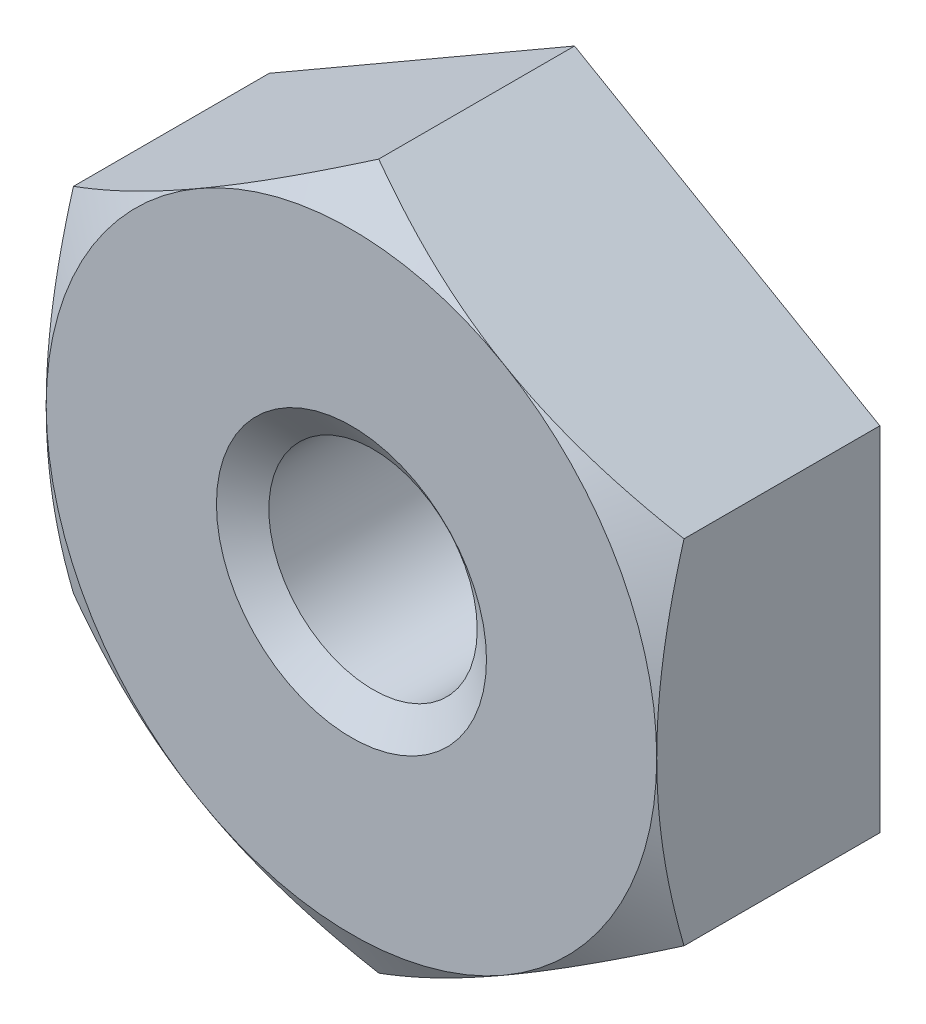
ISO-10303-21;
HEADER;
FILE_DESCRIPTION(('STEP AP214'),'2;1');
FILE_NAME('part.step','',(''),(''),'','','');
FILE_SCHEMA(('AUTOMOTIVE_DESIGN { 1 0 10303 214 1 1 1 1 }'));
ENDSEC;
DATA;
#1=APPLICATION_CONTEXT('core data for automotive mechanical design processes');
#2=APPLICATION_PROTOCOL_DEFINITION('international standard','automotive_design',2000,#1);
#3=PRODUCT_CONTEXT('',#1,'mechanical');
#4=PRODUCT('Part','Part','',(#3));
#5=PRODUCT_RELATED_PRODUCT_CATEGORY('part','',(#4));
#6=PRODUCT_DEFINITION_FORMATION('','',#4);
#7=PRODUCT_DEFINITION_CONTEXT('part definition',#1,'design');
#8=PRODUCT_DEFINITION('design','',#6,#7);
#9=PRODUCT_DEFINITION_SHAPE('','',#8);
#10=(LENGTH_UNIT() NAMED_UNIT(*) SI_UNIT(.MILLI.,.METRE.));
#11=(NAMED_UNIT(*) PLANE_ANGLE_UNIT() SI_UNIT($,.RADIAN.));
#12=(NAMED_UNIT(*) SI_UNIT($,.STERADIAN.) SOLID_ANGLE_UNIT());
#13=UNCERTAINTY_MEASURE_WITH_UNIT(LENGTH_MEASURE(1.E-05),#10,'distance_accuracy_value','');
#14=(GEOMETRIC_REPRESENTATION_CONTEXT(3) GLOBAL_UNCERTAINTY_ASSIGNED_CONTEXT((#13)) GLOBAL_UNIT_ASSIGNED_CONTEXT((#10,
#11,#12)) REPRESENTATION_CONTEXT('',''));
#15=CARTESIAN_POINT('',(0.,0.,0.));
#16=DIRECTION('',(0.,0.,1.));
#17=DIRECTION('',(1.,0.,0.));
#18=AXIS2_PLACEMENT_3D('',#15,#16,#17);
#19=CARTESIAN_POINT('',(0.,0.,-2.8956));
#20=DIRECTION('',(0.,0.,1.));
#21=DIRECTION('',(1.,0.,0.));
#22=AXIS2_PLACEMENT_3D('',#19,#20,#21);
#23=CYLINDRICAL_SURFACE('',#22,1.35255);
#24=CARTESIAN_POINT('',(0.,0.,-0.280118025660793));
#25=DIRECTION('',(0.,0.,1.));
#26=DIRECTION('',(1.,0.,0.));
#27=AXIS2_PLACEMENT_3D('',#24,#25,#26);
#28=CIRCLE('',#27,1.35255);
#29=CARTESIAN_POINT('',(1.35255,0.,-0.280118025660793));
#30=VERTEX_POINT('',#29);
#31=EDGE_CURVE('E133',#30,#30,#28,.F.);
#32=ORIENTED_EDGE('',*,*,#31,.F.);
#33=EDGE_LOOP('',(#32));
#34=FACE_BOUND('',#33,.T.);
#35=CARTESIAN_POINT('',(0.,0.,-2.5900819743392));
#36=DIRECTION('',(0.,0.,-1.));
#37=DIRECTION('',(-1.,0.,0.));
#38=AXIS2_PLACEMENT_3D('',#35,#36,#37);
#39=CIRCLE('',#38,1.35255);
#40=CARTESIAN_POINT('',(-1.35255,0.,-2.5900819743392));
#41=VERTEX_POINT('',#40);
#42=EDGE_CURVE('E39',#41,#41,#39,.F.);
#43=ORIENTED_EDGE('',*,*,#42,.F.);
#44=EDGE_LOOP('',(#43));
#45=FACE_BOUND('',#44,.T.);
#46=ADVANCED_FACE('F34',(#34,#45),#23,.F.);
#47=CARTESIAN_POINT('',(0.,4.57538541327395,-2.8956));
#48=DIRECTION('',(0.,0.,-1.));
#49=DIRECTION('',(-1.,0.,0.));
#50=AXIS2_PLACEMENT_3D('',#47,#48,#49);
#51=PLANE('',#50);
#52=DIRECTION('',(-0.866025403784437,-0.500000000000003,0.));
#53=VECTOR('',#52,1.);
#54=CARTESIAN_POINT('',(0.,4.57538541327395,-2.8956));
#55=LINE('',#54,#53);
#56=CARTESIAN_POINT('',(0.,4.57538541327395,-2.8956));
#57=VERTEX_POINT('',#56);
#58=CARTESIAN_POINT('',(-3.9624,2.28769270663696,-2.8956));
#59=VERTEX_POINT('',#58);
#60=EDGE_CURVE('E265',#57,#59,#55,.T.);
#61=ORIENTED_EDGE('',*,*,#60,.F.);
#62=DIRECTION('',(-0.866025403784438,0.500000000000001,0.));
#63=VECTOR('',#62,1.);
#64=CARTESIAN_POINT('',(3.9624,2.28769270663697,-2.8956));
#65=LINE('',#64,#63);
#66=CARTESIAN_POINT('',(3.9624,2.28769270663697,-2.8956));
#67=VERTEX_POINT('',#66);
#68=EDGE_CURVE('E242',#67,#57,#65,.T.);
#69=ORIENTED_EDGE('',*,*,#68,.F.);
#70=DIRECTION('',(0.,-1.,0.));
#71=VECTOR('',#70,1.);
#72=CARTESIAN_POINT('',(3.9624,2.28769270663697,-2.8956));
#73=LINE('',#72,#71);
#74=CARTESIAN_POINT('',(3.9624,-2.28769270663698,-2.8956));
#75=VERTEX_POINT('',#74);
#76=EDGE_CURVE('E254',#67,#75,#73,.T.);
#77=ORIENTED_EDGE('',*,*,#76,.T.);
#78=DIRECTION('',(0.866025403784437,0.500000000000002,0.));
#79=VECTOR('',#78,1.);
#80=CARTESIAN_POINT('',(0.,-4.57538541327397,-2.8956));
#81=LINE('',#80,#79);
#82=CARTESIAN_POINT('',(0.,-4.57538541327397,-2.8956));
#83=VERTEX_POINT('',#82);
#84=EDGE_CURVE('E256',#83,#75,#81,.T.);
#85=ORIENTED_EDGE('',*,*,#84,.F.);
#86=DIRECTION('',(0.866025403784438,-0.500000000000001,0.));
#87=VECTOR('',#86,1.);
#88=CARTESIAN_POINT('',(-3.9624,-2.28769270663699,-2.8956));
#89=LINE('',#88,#87);
#90=CARTESIAN_POINT('',(-3.9624,-2.28769270663699,-2.8956));
#91=VERTEX_POINT('',#90);
#92=EDGE_CURVE('E259',#91,#83,#89,.T.);
#93=ORIENTED_EDGE('',*,*,#92,.F.);
#94=DIRECTION('',(0.,-1.,0.));
#95=VECTOR('',#94,1.);
#96=CARTESIAN_POINT('',(-3.9624,2.28769270663696,-2.8956));
#97=LINE('',#96,#95);
#98=EDGE_CURVE('E262',#59,#91,#97,.T.);
#99=ORIENTED_EDGE('',*,*,#98,.F.);
#100=EDGE_LOOP('',(#61,#69,#77,#85,#93,#99));
#101=FACE_BOUND('',#100,.T.);
#102=CARTESIAN_POINT('',(0.,0.,-2.8956));
#103=DIRECTION('',(0.,0.,-1.));
#104=DIRECTION('',(-1.,0.,0.));
#105=AXIS2_PLACEMENT_3D('',#102,#103,#104);
#106=CIRCLE('',#105,1.7526);
#107=CARTESIAN_POINT('',(-1.7526,0.,-2.8956));
#108=VERTEX_POINT('',#107);
#109=EDGE_CURVE('E226',#108,#108,#106,.F.);
#110=ORIENTED_EDGE('',*,*,#109,.T.);
#111=EDGE_LOOP('',(#110));
#112=FACE_BOUND('',#111,.T.);
#113=ADVANCED_FACE('F213',(#101,#112),#51,.T.);
#114=CARTESIAN_POINT('',(0.,4.57538541327395,0.));
#115=DIRECTION('',(0.,0.,-1.));
#116=DIRECTION('',(-1.,0.,0.));
#117=AXIS2_PLACEMENT_3D('',#114,#115,#116);
#118=PLANE('',#117);
#119=CARTESIAN_POINT('',(0.,0.,0.));
#120=DIRECTION('',(0.,0.,-1.));
#121=DIRECTION('',(-1.,0.,0.));
#122=AXIS2_PLACEMENT_3D('',#119,#120,#121);
#123=CIRCLE('',#122,3.9624);
#124=CARTESIAN_POINT('',(-1.98120000000001,3.43153905995545,0.));
#125=VERTEX_POINT('',#124);
#126=CARTESIAN_POINT('',(-3.9624,0.,0.));
#127=VERTEX_POINT('',#126);
#128=EDGE_CURVE('E46',#125,#127,#123,.F.);
#129=ORIENTED_EDGE('',*,*,#128,.T.);
#130=CARTESIAN_POINT('',(-1.9812,-3.43153905995546,0.));
#131=VERTEX_POINT('',#130);
#132=EDGE_CURVE('E11',#127,#131,#123,.F.);
#133=ORIENTED_EDGE('',*,*,#132,.T.);
#134=CARTESIAN_POINT('',(1.98120000000001,-3.43153905995545,0.));
#135=VERTEX_POINT('',#134);
#136=EDGE_CURVE('E44',#131,#135,#123,.F.);
#137=ORIENTED_EDGE('',*,*,#136,.T.);
#138=CARTESIAN_POINT('',(3.9624,0.,0.));
#139=VERTEX_POINT('',#138);
#140=EDGE_CURVE('E112',#135,#139,#123,.F.);
#141=ORIENTED_EDGE('',*,*,#140,.T.);
#142=CARTESIAN_POINT('',(0.,0.,0.));
#143=DIRECTION('',(0.,0.,1.));
#144=DIRECTION('',(1.,0.,0.));
#145=AXIS2_PLACEMENT_3D('',#142,#143,#144);
#146=CIRCLE('',#145,3.9624);
#147=CARTESIAN_POINT('',(1.9812,3.43153905995546,0.));
#148=VERTEX_POINT('',#147);
#149=EDGE_CURVE('E124',#139,#148,#146,.T.);
#150=ORIENTED_EDGE('',*,*,#149,.T.);
#151=EDGE_CURVE('E139',#148,#125,#123,.F.);
#152=ORIENTED_EDGE('',*,*,#151,.T.);
#153=EDGE_LOOP('',(#129,#133,#137,#141,#150,#152));
#154=FACE_BOUND('',#153,.T.);
#155=CARTESIAN_POINT('',(0.,0.,0.));
#156=DIRECTION('',(0.,0.,1.));
#157=DIRECTION('',(1.,0.,0.));
#158=AXIS2_PLACEMENT_3D('',#155,#156,#157);
#159=CIRCLE('',#158,1.7526);
#160=CARTESIAN_POINT('',(1.7526,0.,0.));
#161=VERTEX_POINT('',#160);
#162=EDGE_CURVE('E225',#161,#161,#159,.T.);
#163=ORIENTED_EDGE('',*,*,#162,.F.);
#164=EDGE_LOOP('',(#163));
#165=FACE_BOUND('',#164,.T.);
#166=ADVANCED_FACE('F136',(#154,#165),#118,.F.);
#167=CARTESIAN_POINT('',(0.,4.57538541327395,-2.8956));
#168=DIRECTION('',(-0.500000000000003,0.866025403784437,0.));
#169=DIRECTION('',(-0.866025403784437,-0.500000000000003,0.));
#170=AXIS2_PLACEMENT_3D('',#167,#168,#169);
#171=PLANE('',#170);
#172=DIRECTION('',(0.,0.,1.));
#173=VECTOR('',#172,1.);
#174=CARTESIAN_POINT('',(-3.9624,2.28769270663696,-2.8956));
#175=LINE('',#174,#173);
#176=CARTESIAN_POINT('',(-3.9624,2.28769270663696,-0.353907293363031));
#177=VERTEX_POINT('',#176);
#178=EDGE_CURVE('E238',#59,#177,#175,.T.);
#179=ORIENTED_EDGE('',*,*,#178,.T.);
#180=CARTESIAN_POINT('',(-3.9626,2.28757723658313,-0.353973962553351));
#181=CARTESIAN_POINT('',(-3.78847314196163,2.38810942494472,-0.295910500878801));
#182=CARTESIAN_POINT('',(-3.61284323080695,2.48950940142763,-0.243103985012052));
#183=CARTESIAN_POINT('',(-3.25854221893717,2.6940651860048,-0.150929878143085));
#184=CARTESIAN_POINT('',(-3.07986482298996,2.79722462865303,-0.111594894607312));
#185=CARTESIAN_POINT('',(-2.7247243918441,3.00226505217521,-0.0503645307320365));
#186=CARTESIAN_POINT('',(-2.54831599798984,3.10411448585428,-0.0280616253958543));
#187=CARTESIAN_POINT('',(-2.19466918684793,3.30829256746512,-0.00143705026462463));
#188=CARTESIAN_POINT('',(-2.01743205489283,3.41062047330979,0.00290666746161446));
#189=CARTESIAN_POINT('',(-1.68625712619974,3.6018244075396,-0.0061318101541533));
#190=CARTESIAN_POINT('',(-1.53226974326829,3.69072906452688,-0.017294753289042));
#191=CARTESIAN_POINT('',(-1.22529819982381,3.86795916776811,-0.0526740970008359));
#192=CARTESIAN_POINT('',(-1.07231510099383,3.95628400105906,-0.0769025821690752));
#193=CARTESIAN_POINT('',(-0.764710686885745,4.13387949234828,-0.137471671509678));
#194=CARTESIAN_POINT('',(-0.610128302070052,4.2231276738336,-0.174069015441559));
#195=CARTESIAN_POINT('',(-0.303269038029474,4.40029295253076,-0.257130498912952));
#196=CARTESIAN_POINT('',(-0.150988227754984,4.48821231933515,-0.30357512298591));
#197=CARTESIAN_POINT('',(0.000199999999996362,4.57550088332779,-0.353973962553356));
#198=B_SPLINE_CURVE_WITH_KNOTS('',3,(#180,#181,#182,#183,#184,#185,#186,#187,#188,#189,#190,
#191,#192,#193,#194,#195,#196,#197),.UNSPECIFIED.,.F.,.F.,(4,2,2,2,2,2,2,2,4),(0.,
0.628087934683978,1.25768556849603,1.87170106915143,2.48496253800265,3.01893254763584,
3.55339728643648,4.09971704494745,4.64496405448819),.UNSPECIFIED.);
#199=EDGE_CURVE('E58',#177,#125,#198,.T.);
#200=ORIENTED_EDGE('',*,*,#199,.T.);
#201=CARTESIAN_POINT('',(0.,4.57538541327395,-0.353907293363031));
#202=VERTEX_POINT('',#201);
#203=EDGE_CURVE('E147',#125,#202,#198,.T.);
#204=ORIENTED_EDGE('',*,*,#203,.T.);
#205=DIRECTION('',(0.,0.,1.));
#206=VECTOR('',#205,1.);
#207=CARTESIAN_POINT('',(0.,4.57538541327395,-2.8956));
#208=LINE('',#207,#206);
#209=EDGE_CURVE('E237',#57,#202,#208,.T.);
#210=ORIENTED_EDGE('',*,*,#209,.F.);
#211=ORIENTED_EDGE('',*,*,#60,.T.);
#212=EDGE_LOOP('',(#179,#200,#204,#210,#211));
#213=FACE_BOUND('',#212,.T.);
#214=ADVANCED_FACE('F36',(#213),#171,.T.);
#215=CARTESIAN_POINT('',(3.9624,2.28769270663697,-2.8956));
#216=DIRECTION('',(0.500000000000001,0.866025403784438,0.));
#217=DIRECTION('',(-0.866025403784438,0.500000000000001,0.));
#218=AXIS2_PLACEMENT_3D('',#215,#216,#217);
#219=PLANE('',#218);
#220=ORIENTED_EDGE('',*,*,#209,.T.);
#221=CARTESIAN_POINT('',(-0.000200000000003074,4.57550088332779,-0.353973962553357));
#222=CARTESIAN_POINT('',(0.173926858038367,4.47496869496619,-0.295910500878807));
#223=CARTESIAN_POINT('',(0.349556769193046,4.37356871848329,-0.243103985012057));
#224=CARTESIAN_POINT('',(0.703857781062828,4.16901293390611,-0.150929878143089));
#225=CARTESIAN_POINT('',(0.882535177010036,4.06585349125789,-0.111594894607315));
#226=CARTESIAN_POINT('',(1.2376756081559,3.86081306773571,-0.0503645307320388));
#227=CARTESIAN_POINT('',(1.41408400201016,3.75896363405664,-0.0280616253958561));
#228=CARTESIAN_POINT('',(1.76773081315207,3.5547855524458,-0.00143705026462536));
#229=CARTESIAN_POINT('',(1.94496794510718,3.45245764660112,0.0029066674616143));
#230=CARTESIAN_POINT('',(2.27614287380026,3.26125371237132,-0.00613181015415243));
#231=CARTESIAN_POINT('',(2.43013025673171,3.17234905538404,-0.0172947532890406));
#232=CARTESIAN_POINT('',(2.73710180017619,2.99511895214281,-0.0526740970008339));
#233=CARTESIAN_POINT('',(2.89008489900617,2.90679411885186,-0.0769025821690731));
#234=CARTESIAN_POINT('',(3.19768931311426,2.72919862756264,-0.137471671509675));
#235=CARTESIAN_POINT('',(3.35227169792995,2.63995044607732,-0.174069015441556));
#236=CARTESIAN_POINT('',(3.65913096197053,2.46278516738016,-0.257130498912947));
#237=CARTESIAN_POINT('',(3.81141177224502,2.37486580057577,-0.303575122985905));
#238=CARTESIAN_POINT('',(3.9626,2.28757723658313,-0.353973962553351));
#239=B_SPLINE_CURVE_WITH_KNOTS('',3,(#221,#222,#223,#224,#225,#226,#227,#228,#229,#230,#231,
#232,#233,#234,#235,#236,#237,#238),.UNSPECIFIED.,.F.,.F.,(4,2,2,2,2,2,2,2,4),(0.,
0.62808793468398,1.25768556849603,1.87170106915144,2.48496253800265,3.01893254763584,
3.55339728643648,4.09971704494745,4.64496405448819),.UNSPECIFIED.);
#240=EDGE_CURVE('E144',#202,#148,#239,.T.);
#241=ORIENTED_EDGE('',*,*,#240,.T.);
#242=CARTESIAN_POINT('',(3.9624,2.28769270663699,-0.353907293363031));
#243=VERTEX_POINT('',#242);
#244=EDGE_CURVE('E127',#148,#243,#239,.T.);
#245=ORIENTED_EDGE('',*,*,#244,.T.);
#246=DIRECTION('',(0.,0.,1.));
#247=VECTOR('',#246,1.);
#248=CARTESIAN_POINT('',(3.9624,2.28769270663697,-2.8956));
#249=LINE('',#248,#247);
#250=EDGE_CURVE('E143',#67,#243,#249,.T.);
#251=ORIENTED_EDGE('',*,*,#250,.F.);
#252=ORIENTED_EDGE('',*,*,#68,.T.);
#253=EDGE_LOOP('',(#220,#241,#245,#251,#252));
#254=FACE_BOUND('',#253,.T.);
#255=ADVANCED_FACE('F271',(#254),#219,.T.);
#256=CARTESIAN_POINT('',(3.9624,2.28769270663697,-2.8956));
#257=DIRECTION('',(-1.,0.,0.));
#258=DIRECTION('',(0.,0.,1.));
#259=AXIS2_PLACEMENT_3D('',#256,#257,#258);
#260=PLANE('',#259);
#261=CARTESIAN_POINT('',(3.9624,-6.06729819325331,-1.89611421712098));
#262=CARTESIAN_POINT('',(3.9624,-5.89332642630513,-1.81204144982169));
#263=CARTESIAN_POINT('',(3.9624,-5.7189433326559,-1.72880443541161));
#264=CARTESIAN_POINT('',(3.9624,-5.36913208781042,-1.56447949041727));
#265=CARTESIAN_POINT('',(3.9624,-5.19370376202996,-1.48339193192298));
#266=CARTESIAN_POINT('',(3.9624,-4.84063199912483,-1.32341630310581));
#267=CARTESIAN_POINT('',(3.9624,-4.66298163075802,-1.24454347502945));
#268=CARTESIAN_POINT('',(3.9624,-4.30622076400639,-1.09018559791735));
#269=CARTESIAN_POINT('',(3.9624,-4.12711034230788,-1.01470037229225));
#270=CARTESIAN_POINT('',(3.9624,-3.76492098501575,-0.867122354280656));
#271=CARTESIAN_POINT('',(3.9624,-3.58182032430236,-0.795082587744217));
#272=CARTESIAN_POINT('',(3.9624,-3.21345931475096,-0.656645194388402));
#273=CARTESIAN_POINT('',(3.9624,-3.02819872823261,-0.590248195297379));
#274=CARTESIAN_POINT('',(3.9624,-2.65560363262186,-0.464880405995632));
#275=CARTESIAN_POINT('',(3.9624,-2.46827449061948,-0.405893827696869));
#276=CARTESIAN_POINT('',(3.9624,-2.09095307762274,-0.297262572992988));
#277=CARTESIAN_POINT('',(3.9624,-1.90096166930203,-0.24761494234579));
#278=CARTESIAN_POINT('',(3.9624,-1.51818595910837,-0.160071841481474));
#279=CARTESIAN_POINT('',(3.9624,-1.32540092786553,-0.122179500428548));
#280=CARTESIAN_POINT('',(3.9624,-0.937506540249356,-0.060698258104673));
#281=CARTESIAN_POINT('',(3.9624,-0.742397181821192,-0.0371093694797725));
#282=CARTESIAN_POINT('',(3.9624,-0.352110740925444,-0.00632182410583092));
#283=CARTESIAN_POINT('',(3.9624,-0.156942056769732,0.000980595693888285));
#284=CARTESIAN_POINT('',(3.9624,0.233258648002754,-0.00119274815087139));
#285=CARTESIAN_POINT('',(3.9624,0.428290690944866,-0.0106641565176849));
#286=CARTESIAN_POINT('',(3.9624,0.761336165254392,-0.0404944745082214));
#287=CARTESIAN_POINT('',(3.9624,0.899717024969025,-0.0569687086610957));
#288=CARTESIAN_POINT('',(3.9624,1.175409793823,-0.0972902042894315));
#289=CARTESIAN_POINT('',(3.9624,1.31272153087363,-0.121138628570095));
#290=CARTESIAN_POINT('',(3.9624,1.72294112425711,-0.202493569283297));
#291=CARTESIAN_POINT('',(3.9624,1.99392614437752,-0.269788806892755));
#292=CARTESIAN_POINT('',(3.9624,2.39941401436187,-0.38585490553962));
#293=CARTESIAN_POINT('',(3.9624,2.5360304671974,-0.427655830758605));
#294=CARTESIAN_POINT('',(3.9624,2.8078374640585,-0.51539390517362));
#295=CARTESIAN_POINT('',(3.9624,2.94302892071696,-0.561328201478754));
#296=CARTESIAN_POINT('',(3.9624,3.21142059775487,-0.656377205607991));
#297=CARTESIAN_POINT('',(3.9624,3.34462774302138,-0.705472556651416));
#298=CARTESIAN_POINT('',(3.9624,3.61000852418076,-0.806544889265068));
#299=CARTESIAN_POINT('',(3.9624,3.74218171738337,-0.858523035492312));
#300=CARTESIAN_POINT('',(3.9624,3.87387700216209,-0.911658101880299));
#301=B_SPLINE_CURVE_WITH_KNOTS('',3,(#261,#262,#263,#264,#265,#266,#267,#268,#269,#270,#271,
#272,#273,#274,#275,#276,#277,#278,#279,#280,#281,#282,#283,#284,#285,#286,#287,#288,#289,#290,
#291,#292,#293,#294,#295,#296,#297,#298,#299,#300),.UNSPECIFIED.,.F.,.F.,(4,2,2,2,2,2,2,2,2,2,2,
2,2,2,2,2,2,2,2,4),(0.,0.579671177682468,1.15944205483163,1.74253072656317,2.32558896758549,
2.91580535428107,3.50608731374908,4.09508952969443,4.68390510874391,5.27287729157407,
5.86184999512891,6.44705943207008,7.03211694329083,7.44998700301761,7.86792298855809,
8.70441697341047,9.13298808247851,9.56126562407404,9.98713253193218,10.4131727625248),.UNSPECIFIED.);
#302=CARTESIAN_POINT('',(3.96240000000001,-2.28769270663698,-0.353907293363031));
#303=VERTEX_POINT('',#302);
#304=EDGE_CURVE('E108',#303,#139,#301,.T.);
#305=ORIENTED_EDGE('',*,*,#304,.F.);
#306=DIRECTION('',(0.,0.,1.));
#307=VECTOR('',#306,1.);
#308=CARTESIAN_POINT('',(3.9624,-2.28769270663698,-2.8956));
#309=LINE('',#308,#307);
#310=EDGE_CURVE('E247',#75,#303,#309,.T.);
#311=ORIENTED_EDGE('',*,*,#310,.F.);
#312=ORIENTED_EDGE('',*,*,#76,.F.);
#313=ORIENTED_EDGE('',*,*,#250,.T.);
#314=EDGE_CURVE('E121',#139,#243,#301,.T.);
#315=ORIENTED_EDGE('',*,*,#314,.F.);
#316=EDGE_LOOP('',(#305,#311,#312,#313,#315));
#317=FACE_BOUND('',#316,.T.);
#318=ADVANCED_FACE('F141',(#317),#260,.F.);
#319=CARTESIAN_POINT('',(0.,-4.57538541327397,-2.8956));
#320=DIRECTION('',(0.500000000000002,-0.866025403784437,0.));
#321=DIRECTION('',(0.866025403784437,0.500000000000002,0.));
#322=AXIS2_PLACEMENT_3D('',#319,#320,#321);
#323=PLANE('',#322);
#324=ORIENTED_EDGE('',*,*,#310,.T.);
#325=CARTESIAN_POINT('',(3.9626,-2.28757723658314,-0.353973962553354));
#326=CARTESIAN_POINT('',(3.78847314196163,-2.38810942494474,-0.295910500878805));
#327=CARTESIAN_POINT('',(3.61284323080695,-2.48950940142764,-0.243103985012056));
#328=CARTESIAN_POINT('',(3.25854221893717,-2.69406518600482,-0.150929878143089));
#329=CARTESIAN_POINT('',(3.07986482298996,-2.79722462865304,-0.111594894607317));
#330=CARTESIAN_POINT('',(2.7247243918441,-3.00226505217523,-0.0503645307320418));
#331=CARTESIAN_POINT('',(2.54831599798983,-3.1041144858543,-0.02806162539586));
#332=CARTESIAN_POINT('',(2.19466918684792,-3.30829256746513,-0.00143705026463098));
#333=CARTESIAN_POINT('',(2.01743205489282,-3.41062047330981,0.00290666746160774));
#334=CARTESIAN_POINT('',(1.68625712619973,-3.60182440753962,-0.00613181015416055));
#335=CARTESIAN_POINT('',(1.53226974326828,-3.6907290645269,-0.0172947532890494));
#336=CARTESIAN_POINT('',(1.2252981998238,-3.86795916776813,-0.052674097000844));
#337=CARTESIAN_POINT('',(1.07231510099383,-3.95628400105908,-0.0769025821690838));
#338=CARTESIAN_POINT('',(0.764710686885742,-4.1338794923483,-0.137471671509687));
#339=CARTESIAN_POINT('',(0.610128302070049,-4.22312767383361,-0.174069015441568));
#340=CARTESIAN_POINT('',(0.303269038029471,-4.40029295253077,-0.257130498912961));
#341=CARTESIAN_POINT('',(0.150988227754981,-4.48821231933516,-0.303575122985919));
#342=CARTESIAN_POINT('',(-0.000199999999999191,-4.5755008833278,-0.353973962553365));
#343=B_SPLINE_CURVE_WITH_KNOTS('',3,(#325,#326,#327,#328,#329,#330,#331,#332,#333,#334,#335,
#336,#337,#338,#339,#340,#341,#342),.UNSPECIFIED.,.F.,.F.,(4,2,2,2,2,2,2,2,4),(0.,
0.628087934683979,1.25768556849603,1.87170106915144,2.48496253800265,3.01893254763584,
3.55339728643648,4.09971704494745,4.64496405448819),.UNSPECIFIED.);
#344=EDGE_CURVE('E115',#303,#135,#343,.T.);
#345=ORIENTED_EDGE('',*,*,#344,.T.);
#346=CARTESIAN_POINT('',(0.,-4.57538541327395,-0.353907293363031));
#347=VERTEX_POINT('',#346);
#348=EDGE_CURVE('E155',#135,#347,#343,.T.);
#349=ORIENTED_EDGE('',*,*,#348,.T.);
#350=DIRECTION('',(0.,0.,1.));
#351=VECTOR('',#350,1.);
#352=CARTESIAN_POINT('',(0.,-4.57538541327397,-2.8956));
#353=LINE('',#352,#351);
#354=EDGE_CURVE('E244',#83,#347,#353,.T.);
#355=ORIENTED_EDGE('',*,*,#354,.F.);
#356=ORIENTED_EDGE('',*,*,#84,.T.);
#357=EDGE_LOOP('',(#324,#345,#349,#355,#356));
#358=FACE_BOUND('',#357,.T.);
#359=ADVANCED_FACE('F201',(#358),#323,.T.);
#360=CARTESIAN_POINT('',(-3.9624,-2.28769270663699,-2.8956));
#361=DIRECTION('',(-0.500000000000001,-0.866025403784438,0.));
#362=DIRECTION('',(0.866025403784438,-0.500000000000001,0.));
#363=AXIS2_PLACEMENT_3D('',#360,#361,#362);
#364=PLANE('',#363);
#365=ORIENTED_EDGE('',*,*,#354,.T.);
#366=CARTESIAN_POINT('',(0.00020000000000051,-4.5755008833278,-0.353973962553365));
#367=CARTESIAN_POINT('',(-0.17392685803837,-4.47496869496621,-0.295910500878815));
#368=CARTESIAN_POINT('',(-0.34955676919305,-4.3735687184833,-0.243103985012065));
#369=CARTESIAN_POINT('',(-0.703857781062833,-4.16901293390613,-0.150929878143097));
#370=CARTESIAN_POINT('',(-0.882535177010042,-4.0658534912579,-0.111594894607323));
#371=CARTESIAN_POINT('',(-1.2376756081559,-3.86081306773572,-0.050364530732047));
#372=CARTESIAN_POINT('',(-1.41408400201017,-3.75896363405665,-0.0280616253958643));
#373=CARTESIAN_POINT('',(-1.76773081315208,-3.55478555244581,-0.00143705026463345));
#374=CARTESIAN_POINT('',(-1.94496794510719,-3.45245764660114,0.00290666746160626));
#375=CARTESIAN_POINT('',(-2.27614287380027,-3.26125371237133,-0.00613181015416086));
#376=CARTESIAN_POINT('',(-2.43013025673172,-3.17234905538405,-0.0172947532890494));
#377=CARTESIAN_POINT('',(-2.7371018001762,-2.99511895214282,-0.0526740970008424));
#378=CARTESIAN_POINT('',(-2.89008489900618,-2.90679411885187,-0.076902582169081));
#379=CARTESIAN_POINT('',(-3.19768931311426,-2.72919862756265,-0.137471671509682));
#380=CARTESIAN_POINT('',(-3.35227169792995,-2.63995044607734,-0.174069015441562));
#381=CARTESIAN_POINT('',(-3.65913096197053,-2.46278516738018,-0.257130498912953));
#382=CARTESIAN_POINT('',(-3.81141177224502,-2.37486580057579,-0.303575122985911));
#383=CARTESIAN_POINT('',(-3.9626,-2.28757723658315,-0.353973962553357));
#384=B_SPLINE_CURVE_WITH_KNOTS('',3,(#366,#367,#368,#369,#370,#371,#372,#373,#374,#375,#376,
#377,#378,#379,#380,#381,#382,#383),.UNSPECIFIED.,.F.,.F.,(4,2,2,2,2,2,2,2,4),(0.,
0.628087934683981,1.25768556849604,1.87170106915144,2.48496253800266,3.01893254763585,
3.55339728643648,4.09971704494745,4.64496405448819),.UNSPECIFIED.);
#385=EDGE_CURVE('E195',#347,#131,#384,.T.);
#386=ORIENTED_EDGE('',*,*,#385,.T.);
#387=CARTESIAN_POINT('',(-3.9624,-2.28769270663699,-0.353907293363031));
#388=VERTEX_POINT('',#387);
#389=EDGE_CURVE('E187',#131,#388,#384,.T.);
#390=ORIENTED_EDGE('',*,*,#389,.T.);
#391=DIRECTION('',(0.,0.,1.));
#392=VECTOR('',#391,1.);
#393=CARTESIAN_POINT('',(-3.9624,-2.28769270663699,-2.8956));
#394=LINE('',#393,#392);
#395=EDGE_CURVE('E241',#91,#388,#394,.T.);
#396=ORIENTED_EDGE('',*,*,#395,.F.);
#397=ORIENTED_EDGE('',*,*,#92,.T.);
#398=EDGE_LOOP('',(#365,#386,#390,#396,#397));
#399=FACE_BOUND('',#398,.T.);
#400=ADVANCED_FACE('F197',(#399),#364,.T.);
#401=CARTESIAN_POINT('',(-3.9624,2.28769270663696,-2.8956));
#402=DIRECTION('',(-1.,0.,0.));
#403=DIRECTION('',(0.,0.,1.));
#404=AXIS2_PLACEMENT_3D('',#401,#402,#403);
#405=PLANE('',#404);
#406=ORIENTED_EDGE('',*,*,#395,.T.);
#407=CARTESIAN_POINT('',(-3.9624,-6.06729819325332,-1.89611421712098));
#408=CARTESIAN_POINT('',(-3.9624,-5.89332642630514,-1.81204144982169));
#409=CARTESIAN_POINT('',(-3.9624,-5.71894333265591,-1.72880443541161));
#410=CARTESIAN_POINT('',(-3.9624,-5.36913208781043,-1.56447949041727));
#411=CARTESIAN_POINT('',(-3.9624,-5.19370376202997,-1.48339193192298));
#412=CARTESIAN_POINT('',(-3.9624,-4.84063199912483,-1.32341630310581));
#413=CARTESIAN_POINT('',(-3.9624,-4.66298163075803,-1.24454347502945));
#414=CARTESIAN_POINT('',(-3.9624,-4.3062207640064,-1.09018559791735));
#415=CARTESIAN_POINT('',(-3.9624,-4.12711034230789,-1.01470037229225));
#416=CARTESIAN_POINT('',(-3.9624,-3.76492098501575,-0.867122354280658));
#417=CARTESIAN_POINT('',(-3.9624,-3.58182032430237,-0.795082587744219));
#418=CARTESIAN_POINT('',(-3.9624,-3.21345931475096,-0.656645194388404));
#419=CARTESIAN_POINT('',(-3.9624,-3.02819872823261,-0.590248195297381));
#420=CARTESIAN_POINT('',(-3.9624,-2.65560363262186,-0.464880405995634));
#421=CARTESIAN_POINT('',(-3.9624,-2.46827449061949,-0.405893827696871));
#422=CARTESIAN_POINT('',(-3.9624,-2.09095307762275,-0.29726257299299));
#423=CARTESIAN_POINT('',(-3.9624,-1.90096166930203,-0.247614942345792));
#424=CARTESIAN_POINT('',(-3.9624,-1.51818595910838,-0.160071841481475));
#425=CARTESIAN_POINT('',(-3.9624,-1.32540092786553,-0.12217950042855));
#426=CARTESIAN_POINT('',(-3.9624,-0.93750654024936,-0.0606982581046743));
#427=CARTESIAN_POINT('',(-3.9624,-0.742397181821195,-0.0371093694797736));
#428=CARTESIAN_POINT('',(-3.9624,-0.352110740925447,-0.00632182410583184));
#429=CARTESIAN_POINT('',(-3.9624,-0.156942056769735,0.000980595693887333));
#430=CARTESIAN_POINT('',(-3.9624,0.233258648002751,-0.00119274815087244));
#431=CARTESIAN_POINT('',(-3.9624,0.428290690944863,-0.0106641565176861));
#432=CARTESIAN_POINT('',(-3.9624,0.76133616525439,-0.0404944745082223));
#433=CARTESIAN_POINT('',(-3.9624,0.899717024969023,-0.0569687086610963));
#434=CARTESIAN_POINT('',(-3.9624,1.175409793823,-0.097290204289432));
#435=CARTESIAN_POINT('',(-3.9624,1.31272153087363,-0.121138628570096));
#436=CARTESIAN_POINT('',(-3.9624,1.72294112425711,-0.202493569283297));
#437=CARTESIAN_POINT('',(-3.9624,1.99392614437752,-0.269788806892755));
#438=CARTESIAN_POINT('',(-3.9624,2.39941401436187,-0.38585490553962));
#439=CARTESIAN_POINT('',(-3.9624,2.53603046719739,-0.427655830758606));
#440=CARTESIAN_POINT('',(-3.9624,2.8078374640585,-0.51539390517362));
#441=CARTESIAN_POINT('',(-3.9624,2.94302892071695,-0.561328201478754));
#442=CARTESIAN_POINT('',(-3.9624,3.21142059775487,-0.65637720560799));
#443=CARTESIAN_POINT('',(-3.9624,3.34462774302137,-0.705472556651416));
#444=CARTESIAN_POINT('',(-3.9624,3.61000852418076,-0.806544889265068));
#445=CARTESIAN_POINT('',(-3.9624,3.74218171738336,-0.858523035492312));
#446=CARTESIAN_POINT('',(-3.9624,3.87387700216209,-0.911658101880298));
#447=B_SPLINE_CURVE_WITH_KNOTS('',3,(#407,#408,#409,#410,#411,#412,#413,#414,#415,#416,#417,
#418,#419,#420,#421,#422,#423,#424,#425,#426,#427,#428,#429,#430,#431,#432,#433,#434,#435,#436,
#437,#438,#439,#440,#441,#442,#443,#444,#445,#446),.UNSPECIFIED.,.F.,.F.,(4,2,2,2,2,2,2,2,2,2,2,
2,2,2,2,2,2,2,2,4),(0.,0.579671177682468,1.15944205483164,1.74253072656318,2.3255889675855,
2.91580535428107,3.50608731374909,4.09508952969443,4.68390510874391,5.27287729157408,
5.86184999512891,6.44705943207009,7.03211694329084,7.44998700301762,7.8679229885581,
8.70441697341048,9.13298808247851,9.56126562407405,9.98713253193219,10.4131727625248),.UNSPECIFIED.);
#448=EDGE_CURVE('E196',#388,#127,#447,.T.);
#449=ORIENTED_EDGE('',*,*,#448,.T.);
#450=EDGE_CURVE('E132',#127,#177,#447,.T.);
#451=ORIENTED_EDGE('',*,*,#450,.T.);
#452=ORIENTED_EDGE('',*,*,#178,.F.);
#453=ORIENTED_EDGE('',*,*,#98,.T.);
#454=EDGE_LOOP('',(#406,#449,#451,#452,#453));
#455=FACE_BOUND('',#454,.T.);
#456=ADVANCED_FACE('F200',(#455),#405,.T.);
#457=CARTESIAN_POINT('',(0.,0.,0.));
#458=DIRECTION('',(0.,0.,-1.));
#459=DIRECTION('',(-1.,0.,0.));
#460=AXIS2_PLACEMENT_3D('',#457,#458,#459);
#461=CONICAL_SURFACE('',#460,3.9624,1.0471975511966);
#462=ORIENTED_EDGE('',*,*,#450,.F.);
#463=ORIENTED_EDGE('',*,*,#128,.F.);
#464=ORIENTED_EDGE('',*,*,#199,.F.);
#465=EDGE_LOOP('',(#462,#463,#464));
#466=FACE_BOUND('',#465,.T.);
#467=ADVANCED_FACE('F206',(#466),#461,.T.);
#468=ORIENTED_EDGE('',*,*,#151,.F.);
#469=ORIENTED_EDGE('',*,*,#240,.F.);
#470=ORIENTED_EDGE('',*,*,#203,.F.);
#471=EDGE_LOOP('',(#468,#469,#470));
#472=FACE_BOUND('',#471,.T.);
#473=ADVANCED_FACE('F175',(#472),#461,.T.);
#474=ORIENTED_EDGE('',*,*,#149,.F.);
#475=ORIENTED_EDGE('',*,*,#314,.T.);
#476=ORIENTED_EDGE('',*,*,#244,.F.);
#477=EDGE_LOOP('',(#474,#475,#476));
#478=FACE_BOUND('',#477,.T.);
#479=ADVANCED_FACE('F125',(#478),#461,.T.);
#480=ORIENTED_EDGE('',*,*,#304,.T.);
#481=ORIENTED_EDGE('',*,*,#140,.F.);
#482=ORIENTED_EDGE('',*,*,#344,.F.);
#483=EDGE_LOOP('',(#480,#481,#482));
#484=FACE_BOUND('',#483,.T.);
#485=ADVANCED_FACE('F110',(#484),#461,.T.);
#486=ORIENTED_EDGE('',*,*,#136,.F.);
#487=ORIENTED_EDGE('',*,*,#385,.F.);
#488=ORIENTED_EDGE('',*,*,#348,.F.);
#489=EDGE_LOOP('',(#486,#487,#488));
#490=FACE_BOUND('',#489,.T.);
#491=ADVANCED_FACE('F174',(#490),#461,.T.);
#492=ORIENTED_EDGE('',*,*,#132,.F.);
#493=ORIENTED_EDGE('',*,*,#448,.F.);
#494=ORIENTED_EDGE('',*,*,#389,.F.);
#495=EDGE_LOOP('',(#492,#493,#494));
#496=FACE_BOUND('',#495,.T.);
#497=ADVANCED_FACE('F168',(#496),#461,.T.);
#498=CARTESIAN_POINT('',(0.,0.,-0.308129828226873));
#499=DIRECTION('',(0.,0.,1.));
#500=DIRECTION('',(1.,0.,0.));
#501=AXIS2_PLACEMENT_3D('',#498,#499,#500);
#502=CONICAL_SURFACE('',#501,1.312545,0.959931088596882);
#503=ORIENTED_EDGE('',*,*,#162,.T.);
#504=EDGE_LOOP('',(#503));
#505=FACE_BOUND('',#504,.T.);
#506=ORIENTED_EDGE('',*,*,#31,.T.);
#507=EDGE_LOOP('',(#506));
#508=FACE_BOUND('',#507,.T.);
#509=ADVANCED_FACE('F173',(#505,#508),#502,.F.);
#510=CARTESIAN_POINT('',(0.,0.,-2.8702));
#511=DIRECTION('',(0.,0.,-1.));
#512=DIRECTION('',(-1.,0.,0.));
#513=AXIS2_PLACEMENT_3D('',#510,#511,#512);
#514=CONICAL_SURFACE('',#513,1.7526,0.959931088596877);
#515=CARTESIAN_POINT('',(0.,0.,-2.8702));
#516=DIRECTION('',(0.,0.,1.));
#517=DIRECTION('',(1.,0.,0.));
#518=AXIS2_PLACEMENT_3D('',#515,#516,#517);
#519=CIRCLE('',#518,1.7526);
#520=CARTESIAN_POINT('',(1.7526,0.,-2.8702));
#521=VERTEX_POINT('',#520);
#522=EDGE_CURVE('E230',#521,#521,#519,.T.);
#523=ORIENTED_EDGE('',*,*,#522,.F.);
#524=EDGE_LOOP('',(#523));
#525=FACE_BOUND('',#524,.T.);
#526=ORIENTED_EDGE('',*,*,#42,.T.);
#527=EDGE_LOOP('',(#526));
#528=FACE_BOUND('',#527,.T.);
#529=ADVANCED_FACE('F317',(#525,#528),#514,.F.);
#530=CARTESIAN_POINT('',(0.,0.,-25.0375057290932));
#531=DIRECTION('',(0.,0.,1.));
#532=DIRECTION('',(1.,0.,0.));
#533=AXIS2_PLACEMENT_3D('',#530,#531,#532);
#534=CYLINDRICAL_SURFACE('',#533,1.7526);
#535=ORIENTED_EDGE('',*,*,#109,.F.);
#536=EDGE_LOOP('',(#535));
#537=FACE_BOUND('',#536,.T.);
#538=ORIENTED_EDGE('',*,*,#522,.T.);
#539=EDGE_LOOP('',(#538));
#540=FACE_BOUND('',#539,.T.);
#541=ADVANCED_FACE('F324',(#537,#540),#534,.F.);
#542=CLOSED_SHELL('',(#46,#113,#166,#214,#255,#318,#359,#400,#456,#467,#473,#479,#485,#491,#497,
#509,#529,#541));
#543=MANIFOLD_SOLID_BREP('B2',#542);
#544=ADVANCED_BREP_SHAPE_REPRESENTATION('',(#18,#543),#14);
#545=SHAPE_DEFINITION_REPRESENTATION(#9,#544);
ENDSEC;
END-ISO-10303-21;
